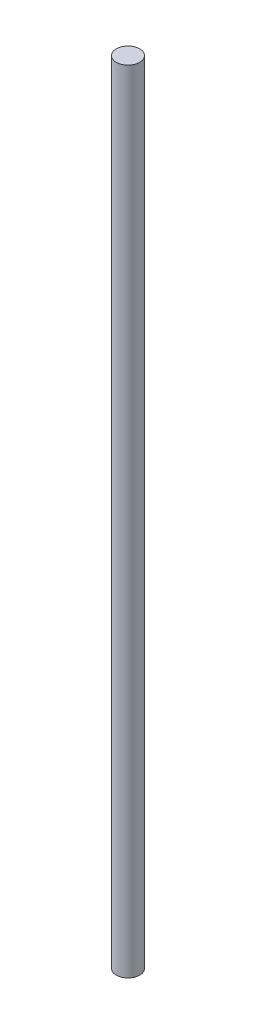
ISO-10303-21;
HEADER;
FILE_DESCRIPTION(('STEP AP214'),'2;1');
FILE_NAME('part.step','',(''),(''),'','','');
FILE_SCHEMA(('AUTOMOTIVE_DESIGN { 1 0 10303 214 1 1 1 1 }'));
ENDSEC;
DATA;
#1=APPLICATION_CONTEXT('core data for automotive mechanical design processes');
#2=APPLICATION_PROTOCOL_DEFINITION('international standard','automotive_design',2000,#1);
#3=PRODUCT_CONTEXT('',#1,'mechanical');
#4=PRODUCT('Part','Part','',(#3));
#5=PRODUCT_RELATED_PRODUCT_CATEGORY('part','',(#4));
#6=PRODUCT_DEFINITION_FORMATION('','',#4);
#7=PRODUCT_DEFINITION_CONTEXT('part definition',#1,'design');
#8=PRODUCT_DEFINITION('design','',#6,#7);
#9=PRODUCT_DEFINITION_SHAPE('','',#8);
#10=(LENGTH_UNIT() NAMED_UNIT(*) SI_UNIT(.MILLI.,.METRE.));
#11=(NAMED_UNIT(*) PLANE_ANGLE_UNIT() SI_UNIT($,.RADIAN.));
#12=(NAMED_UNIT(*) SI_UNIT($,.STERADIAN.) SOLID_ANGLE_UNIT());
#13=UNCERTAINTY_MEASURE_WITH_UNIT(LENGTH_MEASURE(1.E-05),#10,'distance_accuracy_value','');
#14=(GEOMETRIC_REPRESENTATION_CONTEXT(3) GLOBAL_UNCERTAINTY_ASSIGNED_CONTEXT((#13)) GLOBAL_UNIT_ASSIGNED_CONTEXT((#10,
#11,#12)) REPRESENTATION_CONTEXT('',''));
#15=CARTESIAN_POINT('',(0.,0.,0.));
#16=DIRECTION('',(0.,0.,1.));
#17=DIRECTION('',(1.,0.,0.));
#18=AXIS2_PLACEMENT_3D('',#15,#16,#17);
#19=CARTESIAN_POINT('',(0.,33.8,0.));
#20=DIRECTION('',(0.,-1.,0.));
#21=DIRECTION('',(0.,0.,-1.));
#22=AXIS2_PLACEMENT_3D('',#19,#20,#21);
#23=CYLINDRICAL_SURFACE('',#22,0.5);
#24=CARTESIAN_POINT('',(0.,33.8,0.));
#25=DIRECTION('',(0.,1.,0.));
#26=DIRECTION('',(0.,0.,1.));
#27=AXIS2_PLACEMENT_3D('',#24,#25,#26);
#28=CIRCLE('',#27,0.5);
#29=CARTESIAN_POINT('',(0.,33.8,0.5));
#30=VERTEX_POINT('',#29);
#31=EDGE_CURVE('E10',#30,#30,#28,.T.);
#32=ORIENTED_EDGE('',*,*,#31,.F.);
#33=EDGE_LOOP('',(#32));
#34=FACE_BOUND('',#33,.T.);
#35=CARTESIAN_POINT('',(0.,0.,0.));
#36=DIRECTION('',(0.,1.,0.));
#37=DIRECTION('',(0.,0.,1.));
#38=AXIS2_PLACEMENT_3D('',#35,#36,#37);
#39=CIRCLE('',#38,0.5);
#40=CARTESIAN_POINT('',(0.,0.,0.5));
#41=VERTEX_POINT('',#40);
#42=EDGE_CURVE('E42',#41,#41,#39,.T.);
#43=ORIENTED_EDGE('',*,*,#42,.T.);
#44=EDGE_LOOP('',(#43));
#45=FACE_BOUND('',#44,.T.);
#46=ADVANCED_FACE('F39',(#34,#45),#23,.T.);
#47=CARTESIAN_POINT('',(0.,33.8,0.));
#48=DIRECTION('',(0.,1.,0.));
#49=DIRECTION('',(0.,0.,1.));
#50=AXIS2_PLACEMENT_3D('',#47,#48,#49);
#51=PLANE('',#50);
#52=ORIENTED_EDGE('',*,*,#31,.T.);
#53=EDGE_LOOP('',(#52));
#54=FACE_BOUND('',#53,.T.);
#55=ADVANCED_FACE('F54',(#54),#51,.T.);
#56=CARTESIAN_POINT('',(0.,0.,0.));
#57=DIRECTION('',(0.,1.,0.));
#58=DIRECTION('',(0.,0.,1.));
#59=AXIS2_PLACEMENT_3D('',#56,#57,#58);
#60=PLANE('',#59);
#61=ORIENTED_EDGE('',*,*,#42,.F.);
#62=EDGE_LOOP('',(#61));
#63=FACE_BOUND('',#62,.T.);
#64=ADVANCED_FACE('F52',(#63),#60,.F.);
#65=CLOSED_SHELL('',(#46,#55,#64));
#66=MANIFOLD_SOLID_BREP('B2',#65);
#67=ADVANCED_BREP_SHAPE_REPRESENTATION('',(#18,#66),#14);
#68=SHAPE_DEFINITION_REPRESENTATION(#9,#67);
ENDSEC;
END-ISO-10303-21;
